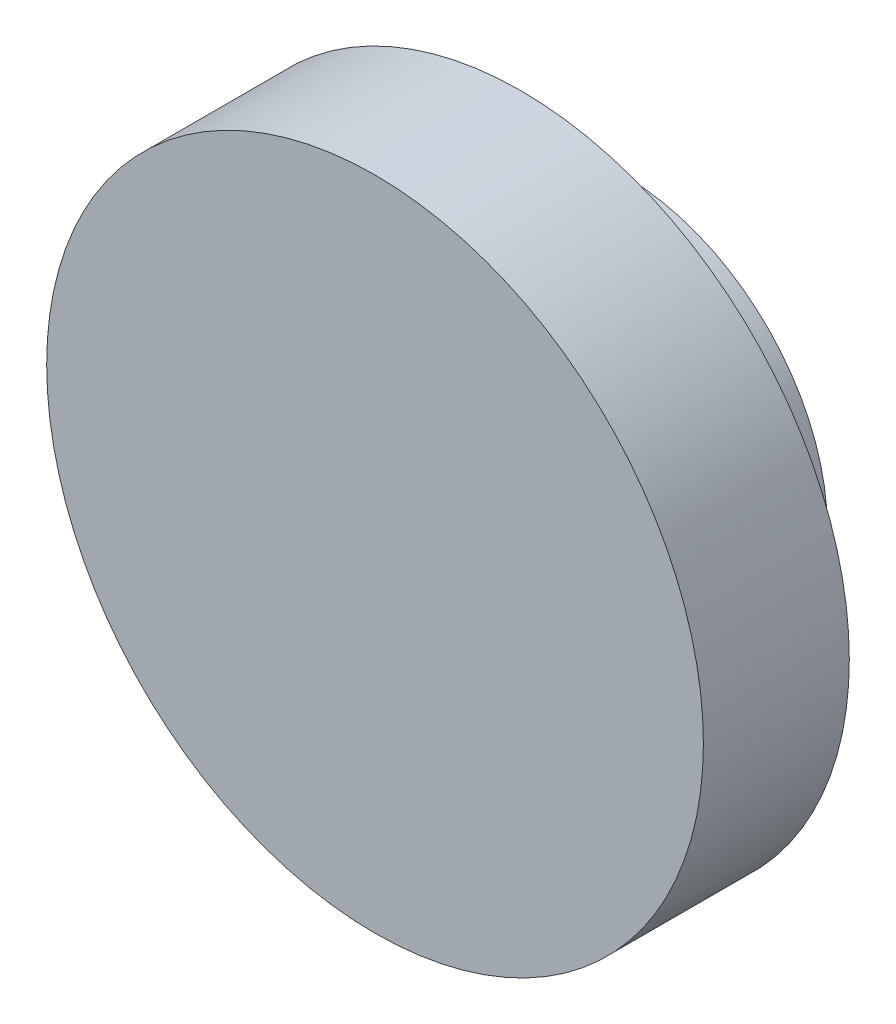
ISO-10303-21;
HEADER;
FILE_DESCRIPTION(('STEP AP214'),'2;1');
FILE_NAME('part.step','',(''),(''),'','','');
FILE_SCHEMA(('AUTOMOTIVE_DESIGN { 1 0 10303 214 1 1 1 1 }'));
ENDSEC;
DATA;
#1=APPLICATION_CONTEXT('core data for automotive mechanical design processes');
#2=APPLICATION_PROTOCOL_DEFINITION('international standard','automotive_design',2000,#1);
#3=PRODUCT_CONTEXT('',#1,'mechanical');
#4=PRODUCT('Part','Part','',(#3));
#5=PRODUCT_RELATED_PRODUCT_CATEGORY('part','',(#4));
#6=PRODUCT_DEFINITION_FORMATION('','',#4);
#7=PRODUCT_DEFINITION_CONTEXT('part definition',#1,'design');
#8=PRODUCT_DEFINITION('design','',#6,#7);
#9=PRODUCT_DEFINITION_SHAPE('','',#8);
#10=(LENGTH_UNIT() NAMED_UNIT(*) SI_UNIT(.MILLI.,.METRE.));
#11=(NAMED_UNIT(*) PLANE_ANGLE_UNIT() SI_UNIT($,.RADIAN.));
#12=(NAMED_UNIT(*) SI_UNIT($,.STERADIAN.) SOLID_ANGLE_UNIT());
#13=UNCERTAINTY_MEASURE_WITH_UNIT(LENGTH_MEASURE(1.E-05),#10,'distance_accuracy_value','');
#14=(GEOMETRIC_REPRESENTATION_CONTEXT(3) GLOBAL_UNCERTAINTY_ASSIGNED_CONTEXT((#13)) GLOBAL_UNIT_ASSIGNED_CONTEXT((#10,
#11,#12)) REPRESENTATION_CONTEXT('',''));
#15=CARTESIAN_POINT('',(0.,0.,0.));
#16=DIRECTION('',(0.,0.,1.));
#17=DIRECTION('',(1.,0.,0.));
#18=AXIS2_PLACEMENT_3D('',#15,#16,#17);
#19=CARTESIAN_POINT('',(0.,0.,-3.));
#20=DIRECTION('',(0.,0.,1.));
#21=DIRECTION('',(1.,0.,0.));
#22=AXIS2_PLACEMENT_3D('',#19,#20,#21);
#23=PLANE('',#22);
#24=CARTESIAN_POINT('',(0.,0.,-3.));
#25=DIRECTION('',(0.,0.,1.));
#26=DIRECTION('',(1.,0.,0.));
#27=AXIS2_PLACEMENT_3D('',#24,#25,#26);
#28=CIRCLE('',#27,14.);
#29=CARTESIAN_POINT('',(14.,0.,-3.));
#30=VERTEX_POINT('',#29);
#31=EDGE_CURVE('E41',#30,#30,#28,.T.);
#32=ORIENTED_EDGE('',*,*,#31,.F.);
#33=EDGE_LOOP('',(#32));
#34=FACE_BOUND('',#33,.T.);
#35=CARTESIAN_POINT('',(0.,0.,-3.));
#36=DIRECTION('',(0.,0.,1.));
#37=DIRECTION('',(1.,0.,0.));
#38=AXIS2_PLACEMENT_3D('',#35,#36,#37);
#39=CIRCLE('',#38,12.25);
#40=CARTESIAN_POINT('',(12.25,0.,-3.));
#41=VERTEX_POINT('',#40);
#42=EDGE_CURVE('E48',#41,#41,#39,.T.);
#43=ORIENTED_EDGE('',*,*,#42,.T.);
#44=EDGE_LOOP('',(#43));
#45=FACE_BOUND('',#44,.T.);
#46=ADVANCED_FACE('F37',(#34,#45),#23,.F.);
#47=CARTESIAN_POINT('',(0.,0.,3.));
#48=DIRECTION('',(0.,0.,-1.));
#49=DIRECTION('',(-1.,0.,0.));
#50=AXIS2_PLACEMENT_3D('',#47,#48,#49);
#51=CYLINDRICAL_SURFACE('',#50,14.);
#52=CARTESIAN_POINT('',(0.,0.,3.));
#53=DIRECTION('',(0.,0.,1.));
#54=DIRECTION('',(1.,0.,0.));
#55=AXIS2_PLACEMENT_3D('',#52,#53,#54);
#56=CIRCLE('',#55,14.);
#57=CARTESIAN_POINT('',(14.,0.,3.));
#58=VERTEX_POINT('',#57);
#59=EDGE_CURVE('E10',#58,#58,#56,.T.);
#60=ORIENTED_EDGE('',*,*,#59,.F.);
#61=EDGE_LOOP('',(#60));
#62=FACE_BOUND('',#61,.T.);
#63=ORIENTED_EDGE('',*,*,#31,.T.);
#64=EDGE_LOOP('',(#63));
#65=FACE_BOUND('',#64,.T.);
#66=ADVANCED_FACE('F39',(#62,#65),#51,.T.);
#67=CARTESIAN_POINT('',(0.,0.,3.));
#68=DIRECTION('',(0.,0.,-1.));
#69=DIRECTION('',(-1.,0.,0.));
#70=AXIS2_PLACEMENT_3D('',#67,#68,#69);
#71=CYLINDRICAL_SURFACE('',#70,12.25);
#72=ORIENTED_EDGE('',*,*,#42,.F.);
#73=EDGE_LOOP('',(#72));
#74=FACE_BOUND('',#73,.T.);
#75=CARTESIAN_POINT('',(0.,0.,4.));
#76=DIRECTION('',(0.,0.,1.));
#77=DIRECTION('',(1.,0.,0.));
#78=AXIS2_PLACEMENT_3D('',#75,#76,#77);
#79=CIRCLE('',#78,12.25);
#80=CARTESIAN_POINT('',(12.25,0.,4.));
#81=VERTEX_POINT('',#80);
#82=EDGE_CURVE('E56',#81,#81,#79,.T.);
#83=ORIENTED_EDGE('',*,*,#82,.T.);
#84=EDGE_LOOP('',(#83));
#85=FACE_BOUND('',#84,.T.);
#86=ADVANCED_FACE('F93',(#74,#85),#71,.F.);
#87=CARTESIAN_POINT('',(0.,0.,3.));
#88=DIRECTION('',(0.,0.,1.));
#89=DIRECTION('',(1.,0.,0.));
#90=AXIS2_PLACEMENT_3D('',#87,#88,#89);
#91=PLANE('',#90);
#92=ORIENTED_EDGE('',*,*,#59,.T.);
#93=EDGE_LOOP('',(#92));
#94=FACE_BOUND('',#93,.T.);
#95=CARTESIAN_POINT('',(0.,0.,3.));
#96=DIRECTION('',(0.,0.,1.));
#97=DIRECTION('',(1.,0.,0.));
#98=AXIS2_PLACEMENT_3D('',#95,#96,#97);
#99=CIRCLE('',#98,15.9630294323613);
#100=CARTESIAN_POINT('',(15.9630294323613,0.,3.));
#101=VERTEX_POINT('',#100);
#102=EDGE_CURVE('E53',#101,#101,#99,.T.);
#103=ORIENTED_EDGE('',*,*,#102,.F.);
#104=EDGE_LOOP('',(#103));
#105=FACE_BOUND('',#104,.T.);
#106=ADVANCED_FACE('F100',(#94,#105),#91,.F.);
#107=CARTESIAN_POINT('',(0.,0.,4.));
#108=DIRECTION('',(0.,0.,-1.));
#109=DIRECTION('',(-1.,0.,0.));
#110=AXIS2_PLACEMENT_3D('',#107,#108,#109);
#111=CYLINDRICAL_SURFACE('',#110,15.9630294323613);
#112=CARTESIAN_POINT('',(0.,0.,4.));
#113=DIRECTION('',(0.,0.,1.));
#114=DIRECTION('',(1.,0.,0.));
#115=AXIS2_PLACEMENT_3D('',#112,#113,#114);
#116=CIRCLE('',#115,15.9630294323613);
#117=CARTESIAN_POINT('',(15.9630294323613,0.,4.));
#118=VERTEX_POINT('',#117);
#119=EDGE_CURVE('E52',#118,#118,#116,.T.);
#120=ORIENTED_EDGE('',*,*,#119,.F.);
#121=EDGE_LOOP('',(#120));
#122=FACE_BOUND('',#121,.T.);
#123=ORIENTED_EDGE('',*,*,#102,.T.);
#124=EDGE_LOOP('',(#123));
#125=FACE_BOUND('',#124,.T.);
#126=ADVANCED_FACE('F86',(#122,#125),#111,.T.);
#127=CARTESIAN_POINT('',(0.,0.,4.));
#128=DIRECTION('',(0.,0.,1.));
#129=DIRECTION('',(1.,0.,0.));
#130=AXIS2_PLACEMENT_3D('',#127,#128,#129);
#131=PLANE('',#130);
#132=ORIENTED_EDGE('',*,*,#82,.F.);
#133=EDGE_LOOP('',(#132));
#134=FACE_BOUND('',#133,.T.);
#135=ADVANCED_FACE('F73',(#134),#131,.F.);
#136=CARTESIAN_POINT('',(0.,0.,14.));
#137=DIRECTION('',(0.,0.,-1.));
#138=DIRECTION('',(-1.,0.,0.));
#139=AXIS2_PLACEMENT_3D('',#136,#137,#138);
#140=CYLINDRICAL_SURFACE('',#139,22.5);
#141=CARTESIAN_POINT('',(0.,0.,14.));
#142=DIRECTION('',(0.,0.,1.));
#143=DIRECTION('',(1.,0.,0.));
#144=AXIS2_PLACEMENT_3D('',#141,#142,#143);
#145=CIRCLE('',#144,22.5);
#146=CARTESIAN_POINT('',(22.5,0.,14.));
#147=VERTEX_POINT('',#146);
#148=EDGE_CURVE('E61',#147,#147,#145,.T.);
#149=ORIENTED_EDGE('',*,*,#148,.F.);
#150=EDGE_LOOP('',(#149));
#151=FACE_BOUND('',#150,.T.);
#152=CARTESIAN_POINT('',(0.,0.,4.));
#153=DIRECTION('',(0.,0.,1.));
#154=DIRECTION('',(1.,0.,0.));
#155=AXIS2_PLACEMENT_3D('',#152,#153,#154);
#156=CIRCLE('',#155,22.5);
#157=CARTESIAN_POINT('',(22.5,0.,4.));
#158=VERTEX_POINT('',#157);
#159=EDGE_CURVE('E62',#158,#158,#156,.T.);
#160=ORIENTED_EDGE('',*,*,#159,.T.);
#161=EDGE_LOOP('',(#160));
#162=FACE_BOUND('',#161,.T.);
#163=ADVANCED_FACE('F70',(#151,#162),#140,.T.);
#164=CARTESIAN_POINT('',(0.,0.,14.));
#165=DIRECTION('',(0.,0.,1.));
#166=DIRECTION('',(1.,0.,0.));
#167=AXIS2_PLACEMENT_3D('',#164,#165,#166);
#168=PLANE('',#167);
#169=ORIENTED_EDGE('',*,*,#148,.T.);
#170=EDGE_LOOP('',(#169));
#171=FACE_BOUND('',#170,.T.);
#172=ADVANCED_FACE('F68',(#171),#168,.T.);
#173=ORIENTED_EDGE('',*,*,#119,.T.);
#174=EDGE_LOOP('',(#173));
#175=FACE_BOUND('',#174,.T.);
#176=ORIENTED_EDGE('',*,*,#159,.F.);
#177=EDGE_LOOP('',(#176));
#178=FACE_BOUND('',#177,.T.);
#179=ADVANCED_FACE('F77',(#175,#178),#131,.F.);
#180=CLOSED_SHELL('',(#46,#66,#86,#106,#126,#135,#163,#172,#179));
#181=MANIFOLD_SOLID_BREP('B2',#180);
#182=ADVANCED_BREP_SHAPE_REPRESENTATION('',(#18,#181),#14);
#183=SHAPE_DEFINITION_REPRESENTATION(#9,#182);
ENDSEC;
END-ISO-10303-21;
